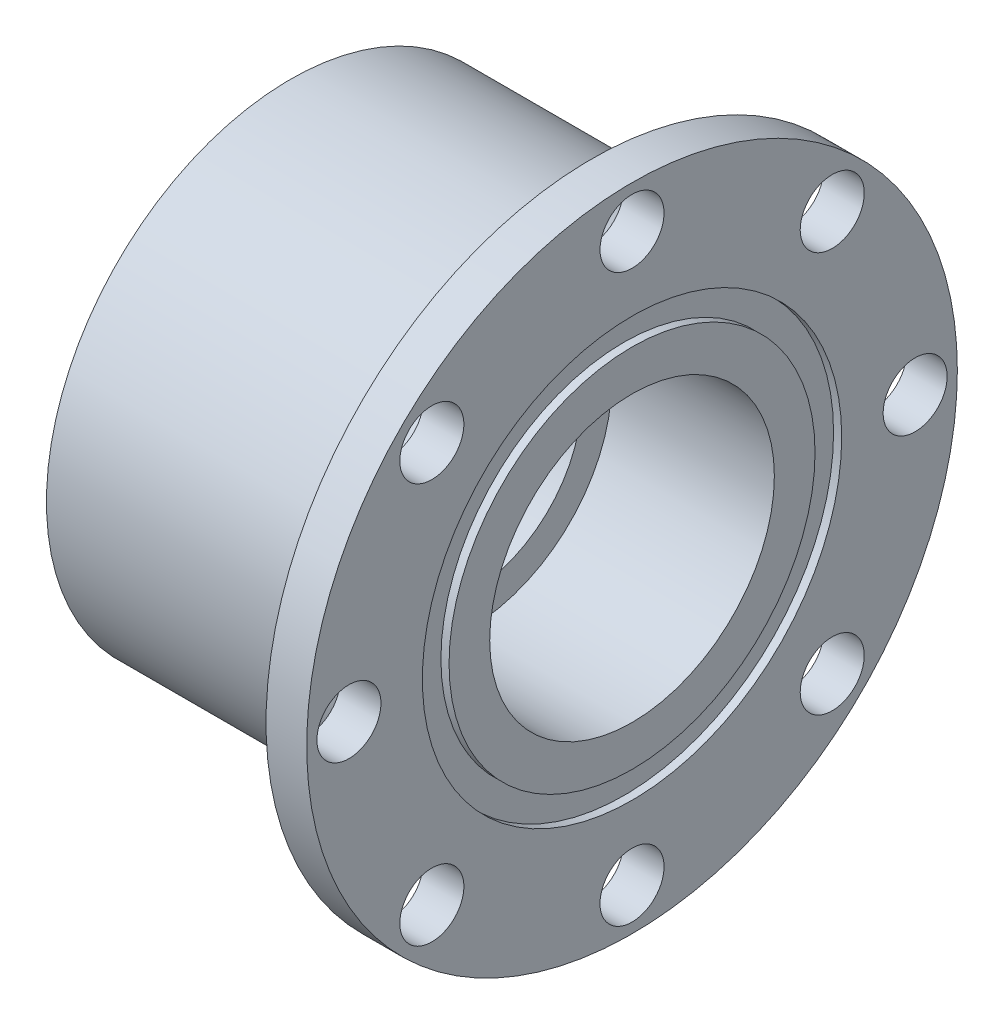
ISO-10303-21;
HEADER;
FILE_DESCRIPTION(('STEP AP214'),'2;1');
FILE_NAME('part.step','',(''),(''),'','','');
FILE_SCHEMA(('AUTOMOTIVE_DESIGN { 1 0 10303 214 1 1 1 1 }'));
ENDSEC;
DATA;
#1=APPLICATION_CONTEXT('core data for automotive mechanical design processes');
#2=APPLICATION_PROTOCOL_DEFINITION('international standard','automotive_design',2000,#1);
#3=PRODUCT_CONTEXT('',#1,'mechanical');
#4=PRODUCT('Part','Part','',(#3));
#5=PRODUCT_RELATED_PRODUCT_CATEGORY('part','',(#4));
#6=PRODUCT_DEFINITION_FORMATION('','',#4);
#7=PRODUCT_DEFINITION_CONTEXT('part definition',#1,'design');
#8=PRODUCT_DEFINITION('design','',#6,#7);
#9=PRODUCT_DEFINITION_SHAPE('','',#8);
#10=(LENGTH_UNIT() NAMED_UNIT(*) SI_UNIT(.MILLI.,.METRE.));
#11=(NAMED_UNIT(*) PLANE_ANGLE_UNIT() SI_UNIT($,.RADIAN.));
#12=(NAMED_UNIT(*) SI_UNIT($,.STERADIAN.) SOLID_ANGLE_UNIT());
#13=UNCERTAINTY_MEASURE_WITH_UNIT(LENGTH_MEASURE(1.E-05),#10,'distance_accuracy_value','');
#14=(GEOMETRIC_REPRESENTATION_CONTEXT(3) GLOBAL_UNCERTAINTY_ASSIGNED_CONTEXT((#13)) GLOBAL_UNIT_ASSIGNED_CONTEXT((#10,
#11,#12)) REPRESENTATION_CONTEXT('',''));
#15=CARTESIAN_POINT('',(0.,0.,0.));
#16=DIRECTION('',(0.,0.,1.));
#17=DIRECTION('',(1.,0.,0.));
#18=AXIS2_PLACEMENT_3D('',#15,#16,#17);
#19=CARTESIAN_POINT('',(53.34,0.,0.));
#20=DIRECTION('',(1.,0.,0.));
#21=DIRECTION('',(0.,0.,-1.));
#22=AXIS2_PLACEMENT_3D('',#19,#20,#21);
#23=PLANE('',#22);
#24=CARTESIAN_POINT('',(53.34,0.,0.));
#25=DIRECTION('',(1.,0.,0.));
#26=DIRECTION('',(0.,0.,-1.));
#27=AXIS2_PLACEMENT_3D('',#24,#25,#26);
#28=CIRCLE('',#27,22.225);
#29=CARTESIAN_POINT('',(53.34,0.,-22.225));
#30=VERTEX_POINT('',#29);
#31=EDGE_CURVE('E61',#30,#30,#28,.T.);
#32=ORIENTED_EDGE('',*,*,#31,.F.);
#33=EDGE_LOOP('',(#32));
#34=FACE_BOUND('',#33,.T.);
#35=CARTESIAN_POINT('',(53.34,0.,0.));
#36=DIRECTION('',(1.,0.,0.));
#37=DIRECTION('',(0.,0.,-1.));
#38=AXIS2_PLACEMENT_3D('',#35,#36,#37);
#39=CIRCLE('',#38,28.575);
#40=CARTESIAN_POINT('',(53.34,0.,-28.575));
#41=VERTEX_POINT('',#40);
#42=EDGE_CURVE('E243',#41,#41,#39,.T.);
#43=ORIENTED_EDGE('',*,*,#42,.T.);
#44=EDGE_LOOP('',(#43));
#45=FACE_BOUND('',#44,.T.);
#46=ADVANCED_FACE('F43',(#34,#45),#23,.T.);
#47=CARTESIAN_POINT('',(46.99,0.,0.));
#48=DIRECTION('',(1.,0.,0.));
#49=DIRECTION('',(0.,0.,-1.));
#50=AXIS2_PLACEMENT_3D('',#47,#48,#49);
#51=PLANE('',#50);
#52=CARTESIAN_POINT('',(46.99,0.,-44.2066880427784));
#53=DIRECTION('',(-1.,0.,0.));
#54=DIRECTION('',(0.,0.,1.));
#55=AXIS2_PLACEMENT_3D('',#52,#53,#54);
#56=CIRCLE('',#55,5.);
#57=CARTESIAN_POINT('',(46.99,0.,-39.2066880427784));
#58=VERTEX_POINT('',#57);
#59=EDGE_CURVE('E250',#58,#58,#56,.T.);
#60=ORIENTED_EDGE('',*,*,#59,.F.);
#61=EDGE_LOOP('',(#60));
#62=FACE_BOUND('',#61,.T.);
#63=CARTESIAN_POINT('',(46.99,31.2588488888469,-31.2588488888468));
#64=DIRECTION('',(-1.,0.,0.));
#65=DIRECTION('',(0.,0.,1.));
#66=AXIS2_PLACEMENT_3D('',#63,#64,#65);
#67=CIRCLE('',#66,5.);
#68=CARTESIAN_POINT('',(46.99,31.2588488888469,-26.2588488888468));
#69=VERTEX_POINT('',#68);
#70=EDGE_CURVE('E255',#69,#69,#67,.T.);
#71=ORIENTED_EDGE('',*,*,#70,.F.);
#72=EDGE_LOOP('',(#71));
#73=FACE_BOUND('',#72,.T.);
#74=CARTESIAN_POINT('',(46.99,44.2066880427784,1.54346826353421E-13));
#75=DIRECTION('',(-1.,0.,0.));
#76=DIRECTION('',(0.,0.,1.));
#77=AXIS2_PLACEMENT_3D('',#74,#75,#76);
#78=CIRCLE('',#77,5.);
#79=CARTESIAN_POINT('',(46.99,44.2066880427784,5.00000000000015));
#80=VERTEX_POINT('',#79);
#81=EDGE_CURVE('E259',#80,#80,#78,.T.);
#82=ORIENTED_EDGE('',*,*,#81,.F.);
#83=EDGE_LOOP('',(#82));
#84=FACE_BOUND('',#83,.T.);
#85=CARTESIAN_POINT('',(46.99,-3.08693652706841E-13,44.2066880427784));
#86=DIRECTION('',(-1.,0.,0.));
#87=DIRECTION('',(0.,0.,1.));
#88=AXIS2_PLACEMENT_3D('',#85,#86,#87);
#89=CIRCLE('',#88,5.);
#90=CARTESIAN_POINT('',(46.99,-3.08693652706841E-13,49.2066880427784));
#91=VERTEX_POINT('',#90);
#92=EDGE_CURVE('E267',#91,#91,#89,.T.);
#93=ORIENTED_EDGE('',*,*,#92,.F.);
#94=EDGE_LOOP('',(#93));
#95=FACE_BOUND('',#94,.T.);
#96=CARTESIAN_POINT('',(46.99,-31.2588488888471,31.2588488888466));
#97=DIRECTION('',(-1.,0.,0.));
#98=DIRECTION('',(0.,0.,1.));
#99=AXIS2_PLACEMENT_3D('',#96,#97,#98);
#100=CIRCLE('',#99,5.);
#101=CARTESIAN_POINT('',(46.99,-31.2588488888471,36.2588488888466));
#102=VERTEX_POINT('',#101);
#103=EDGE_CURVE('E271',#102,#102,#100,.T.);
#104=ORIENTED_EDGE('',*,*,#103,.F.);
#105=EDGE_LOOP('',(#104));
#106=FACE_BOUND('',#105,.T.);
#107=CARTESIAN_POINT('',(46.99,-44.2066880427784,-4.63040479060262E-13));
#108=DIRECTION('',(-1.,0.,0.));
#109=DIRECTION('',(0.,0.,1.));
#110=AXIS2_PLACEMENT_3D('',#107,#108,#109);
#111=CIRCLE('',#110,5.);
#112=CARTESIAN_POINT('',(46.99,-44.2066880427784,4.99999999999953));
#113=VERTEX_POINT('',#112);
#114=EDGE_CURVE('E164',#113,#113,#111,.T.);
#115=ORIENTED_EDGE('',*,*,#114,.F.);
#116=EDGE_LOOP('',(#115));
#117=FACE_BOUND('',#116,.T.);
#118=CARTESIAN_POINT('',(46.99,0.,0.));
#119=DIRECTION('',(1.,0.,0.));
#120=DIRECTION('',(0.,0.,-1.));
#121=AXIS2_PLACEMENT_3D('',#118,#119,#120);
#122=CIRCLE('',#121,50.8);
#123=CARTESIAN_POINT('',(46.99,0.,-50.8));
#124=VERTEX_POINT('',#123);
#125=EDGE_CURVE('E68',#124,#124,#122,.T.);
#126=ORIENTED_EDGE('',*,*,#125,.F.);
#127=EDGE_LOOP('',(#126));
#128=FACE_BOUND('',#127,.T.);
#129=CARTESIAN_POINT('',(46.99,0.,0.));
#130=DIRECTION('',(1.,0.,0.));
#131=DIRECTION('',(0.,0.,-1.));
#132=AXIS2_PLACEMENT_3D('',#129,#130,#131);
#133=CIRCLE('',#132,38.1);
#134=CARTESIAN_POINT('',(46.99,0.,-38.1));
#135=VERTEX_POINT('',#134);
#136=EDGE_CURVE('E10',#135,#135,#133,.T.);
#137=ORIENTED_EDGE('',*,*,#136,.T.);
#138=EDGE_LOOP('',(#137));
#139=FACE_BOUND('',#138,.T.);
#140=CARTESIAN_POINT('',(46.99,-31.2588488888465,-31.2588488888472));
#141=DIRECTION('',(-1.,0.,0.));
#142=DIRECTION('',(0.,0.,1.));
#143=AXIS2_PLACEMENT_3D('',#140,#141,#142);
#144=CIRCLE('',#143,5.);
#145=CARTESIAN_POINT('',(46.99,-31.2588488888465,-26.2588488888472));
#146=VERTEX_POINT('',#145);
#147=EDGE_CURVE('E163',#146,#146,#144,.T.);
#148=ORIENTED_EDGE('',*,*,#147,.F.);
#149=EDGE_LOOP('',(#148));
#150=FACE_BOUND('',#149,.T.);
#151=CARTESIAN_POINT('',(46.99,31.2588488888467,31.258848888847));
#152=DIRECTION('',(-1.,0.,0.));
#153=DIRECTION('',(0.,0.,1.));
#154=AXIS2_PLACEMENT_3D('',#151,#152,#153);
#155=CIRCLE('',#154,5.);
#156=CARTESIAN_POINT('',(46.99,31.2588488888467,36.258848888847));
#157=VERTEX_POINT('',#156);
#158=EDGE_CURVE('E263',#157,#157,#155,.T.);
#159=ORIENTED_EDGE('',*,*,#158,.F.);
#160=EDGE_LOOP('',(#159));
#161=FACE_BOUND('',#160,.T.);
#162=ADVANCED_FACE('F104',(#62,#73,#84,#95,#106,#117,#128,#139,#150,#161),#51,.F.);
#163=CARTESIAN_POINT('',(53.34,0.,0.));
#164=DIRECTION('',(1.,0.,0.));
#165=DIRECTION('',(0.,0.,-1.));
#166=AXIS2_PLACEMENT_3D('',#163,#164,#165);
#167=CIRCLE('',#166,32.7406);
#168=CARTESIAN_POINT('',(53.34,0.,-32.7406));
#169=VERTEX_POINT('',#168);
#170=EDGE_CURVE('E127',#169,#169,#167,.T.);
#171=ORIENTED_EDGE('',*,*,#170,.F.);
#172=EDGE_LOOP('',(#171));
#173=FACE_BOUND('',#172,.T.);
#174=CARTESIAN_POINT('',(53.34,0.,-44.2066880427784));
#175=DIRECTION('',(-1.,0.,0.));
#176=DIRECTION('',(0.,0.,1.));
#177=AXIS2_PLACEMENT_3D('',#174,#175,#176);
#178=CIRCLE('',#177,5.);
#179=CARTESIAN_POINT('',(53.34,0.,-39.2066880427784));
#180=VERTEX_POINT('',#179);
#181=EDGE_CURVE('E131',#180,#180,#178,.T.);
#182=ORIENTED_EDGE('',*,*,#181,.T.);
#183=EDGE_LOOP('',(#182));
#184=FACE_BOUND('',#183,.T.);
#185=CARTESIAN_POINT('',(53.34,31.2588488888469,-31.2588488888468));
#186=DIRECTION('',(-1.,0.,0.));
#187=DIRECTION('',(0.,0.,1.));
#188=AXIS2_PLACEMENT_3D('',#185,#186,#187);
#189=CIRCLE('',#188,5.);
#190=CARTESIAN_POINT('',(53.34,31.2588488888469,-26.2588488888468));
#191=VERTEX_POINT('',#190);
#192=EDGE_CURVE('E135',#191,#191,#189,.T.);
#193=ORIENTED_EDGE('',*,*,#192,.T.);
#194=EDGE_LOOP('',(#193));
#195=FACE_BOUND('',#194,.T.);
#196=CARTESIAN_POINT('',(53.34,44.2066880427784,1.54346826353421E-13));
#197=DIRECTION('',(-1.,0.,0.));
#198=DIRECTION('',(0.,0.,1.));
#199=AXIS2_PLACEMENT_3D('',#196,#197,#198);
#200=CIRCLE('',#199,5.);
#201=CARTESIAN_POINT('',(53.34,44.2066880427784,5.00000000000015));
#202=VERTEX_POINT('',#201);
#203=EDGE_CURVE('E139',#202,#202,#200,.T.);
#204=ORIENTED_EDGE('',*,*,#203,.T.);
#205=EDGE_LOOP('',(#204));
#206=FACE_BOUND('',#205,.T.);
#207=CARTESIAN_POINT('',(53.34,31.2588488888467,31.258848888847));
#208=DIRECTION('',(-1.,0.,0.));
#209=DIRECTION('',(0.,0.,1.));
#210=AXIS2_PLACEMENT_3D('',#207,#208,#209);
#211=CIRCLE('',#210,5.);
#212=CARTESIAN_POINT('',(53.34,31.2588488888467,36.258848888847));
#213=VERTEX_POINT('',#212);
#214=EDGE_CURVE('E143',#213,#213,#211,.T.);
#215=ORIENTED_EDGE('',*,*,#214,.T.);
#216=EDGE_LOOP('',(#215));
#217=FACE_BOUND('',#216,.T.);
#218=CARTESIAN_POINT('',(53.34,-3.08693652706841E-13,44.2066880427784));
#219=DIRECTION('',(-1.,0.,0.));
#220=DIRECTION('',(0.,0.,1.));
#221=AXIS2_PLACEMENT_3D('',#218,#219,#220);
#222=CIRCLE('',#221,5.);
#223=CARTESIAN_POINT('',(53.34,-3.08693652706841E-13,49.2066880427784));
#224=VERTEX_POINT('',#223);
#225=EDGE_CURVE('E147',#224,#224,#222,.T.);
#226=ORIENTED_EDGE('',*,*,#225,.T.);
#227=EDGE_LOOP('',(#226));
#228=FACE_BOUND('',#227,.T.);
#229=CARTESIAN_POINT('',(53.34,-31.2588488888471,31.2588488888466));
#230=DIRECTION('',(-1.,0.,0.));
#231=DIRECTION('',(0.,0.,1.));
#232=AXIS2_PLACEMENT_3D('',#229,#230,#231);
#233=CIRCLE('',#232,5.);
#234=CARTESIAN_POINT('',(53.34,-31.2588488888471,36.2588488888466));
#235=VERTEX_POINT('',#234);
#236=EDGE_CURVE('E151',#235,#235,#233,.T.);
#237=ORIENTED_EDGE('',*,*,#236,.T.);
#238=EDGE_LOOP('',(#237));
#239=FACE_BOUND('',#238,.T.);
#240=CARTESIAN_POINT('',(53.34,0.,0.));
#241=DIRECTION('',(1.,0.,0.));
#242=DIRECTION('',(0.,0.,-1.));
#243=AXIS2_PLACEMENT_3D('',#240,#241,#242);
#244=CIRCLE('',#243,50.8);
#245=CARTESIAN_POINT('',(53.34,0.,-50.8));
#246=VERTEX_POINT('',#245);
#247=EDGE_CURVE('E59',#246,#246,#244,.T.);
#248=ORIENTED_EDGE('',*,*,#247,.T.);
#249=EDGE_LOOP('',(#248));
#250=FACE_BOUND('',#249,.T.);
#251=CARTESIAN_POINT('',(53.34,-31.2588488888465,-31.2588488888472));
#252=DIRECTION('',(-1.,0.,0.));
#253=DIRECTION('',(0.,0.,1.));
#254=AXIS2_PLACEMENT_3D('',#251,#252,#253);
#255=CIRCLE('',#254,5.);
#256=CARTESIAN_POINT('',(53.34,-31.2588488888465,-26.2588488888472));
#257=VERTEX_POINT('',#256);
#258=EDGE_CURVE('E158',#257,#257,#255,.T.);
#259=ORIENTED_EDGE('',*,*,#258,.T.);
#260=EDGE_LOOP('',(#259));
#261=FACE_BOUND('',#260,.T.);
#262=CARTESIAN_POINT('',(53.34,-44.2066880427784,-4.63040479060262E-13));
#263=DIRECTION('',(-1.,0.,0.));
#264=DIRECTION('',(0.,0.,1.));
#265=AXIS2_PLACEMENT_3D('',#262,#263,#264);
#266=CIRCLE('',#265,5.);
#267=CARTESIAN_POINT('',(53.34,-44.2066880427784,4.99999999999953));
#268=VERTEX_POINT('',#267);
#269=EDGE_CURVE('E161',#268,#268,#266,.T.);
#270=ORIENTED_EDGE('',*,*,#269,.T.);
#271=EDGE_LOOP('',(#270));
#272=FACE_BOUND('',#271,.T.);
#273=ADVANCED_FACE('F106',(#173,#184,#195,#206,#217,#228,#239,#250,#261,#272),#23,.T.);
#274=CARTESIAN_POINT('',(17.69,0.,0.));
#275=DIRECTION('',(1.,0.,0.));
#276=DIRECTION('',(0.,0.,-1.));
#277=AXIS2_PLACEMENT_3D('',#274,#275,#276);
#278=CYLINDRICAL_SURFACE('',#277,9.);
#279=CARTESIAN_POINT('',(17.69,0.,0.));
#280=DIRECTION('',(1.,0.,0.));
#281=DIRECTION('',(0.,0.,-1.));
#282=AXIS2_PLACEMENT_3D('',#279,#280,#281);
#283=CIRCLE('',#282,9.);
#284=CARTESIAN_POINT('',(17.69,0.,-9.));
#285=VERTEX_POINT('',#284);
#286=EDGE_CURVE('E64',#285,#285,#283,.T.);
#287=ORIENTED_EDGE('',*,*,#286,.T.);
#288=EDGE_LOOP('',(#287));
#289=FACE_BOUND('',#288,.T.);
#290=CARTESIAN_POINT('',(13.,0.,0.));
#291=DIRECTION('',(-1.,0.,0.));
#292=DIRECTION('',(0.,0.,1.));
#293=AXIS2_PLACEMENT_3D('',#290,#291,#292);
#294=CIRCLE('',#293,9.);
#295=CARTESIAN_POINT('',(13.,0.,9.));
#296=VERTEX_POINT('',#295);
#297=EDGE_CURVE('E47',#296,#296,#294,.F.);
#298=ORIENTED_EDGE('',*,*,#297,.F.);
#299=EDGE_LOOP('',(#298));
#300=FACE_BOUND('',#299,.T.);
#301=ADVANCED_FACE('F117',(#289,#300),#278,.F.);
#302=CARTESIAN_POINT('',(27.94,0.,0.));
#303=DIRECTION('',(-1.,0.,0.));
#304=DIRECTION('',(0.,0.,1.));
#305=AXIS2_PLACEMENT_3D('',#302,#303,#304);
#306=CYLINDRICAL_SURFACE('',#305,38.1);
#307=CARTESIAN_POINT('',(0.,0.,0.));
#308=DIRECTION('',(1.,0.,0.));
#309=DIRECTION('',(0.,0.,-1.));
#310=AXIS2_PLACEMENT_3D('',#307,#308,#309);
#311=CIRCLE('',#310,38.1);
#312=CARTESIAN_POINT('',(0.,0.,-38.1));
#313=VERTEX_POINT('',#312);
#314=EDGE_CURVE('E51',#313,#313,#311,.T.);
#315=ORIENTED_EDGE('',*,*,#314,.T.);
#316=EDGE_LOOP('',(#315));
#317=FACE_BOUND('',#316,.T.);
#318=ORIENTED_EDGE('',*,*,#136,.F.);
#319=EDGE_LOOP('',(#318));
#320=FACE_BOUND('',#319,.T.);
#321=ADVANCED_FACE('F45',(#317,#320),#306,.T.);
#322=CARTESIAN_POINT('',(27.94,0.,0.));
#323=DIRECTION('',(1.,0.,0.));
#324=DIRECTION('',(0.,0.,-1.));
#325=AXIS2_PLACEMENT_3D('',#322,#323,#324);
#326=PLANE('',#325);
#327=CARTESIAN_POINT('',(27.94,0.,0.));
#328=DIRECTION('',(1.,0.,0.));
#329=DIRECTION('',(0.,0.,-1.));
#330=AXIS2_PLACEMENT_3D('',#327,#328,#329);
#331=CIRCLE('',#330,17.5);
#332=CARTESIAN_POINT('',(27.94,0.,-17.5));
#333=VERTEX_POINT('',#332);
#334=EDGE_CURVE('E71',#333,#333,#331,.T.);
#335=ORIENTED_EDGE('',*,*,#334,.F.);
#336=EDGE_LOOP('',(#335));
#337=FACE_BOUND('',#336,.T.);
#338=CARTESIAN_POINT('',(27.94,0.,0.));
#339=DIRECTION('',(1.,0.,0.));
#340=DIRECTION('',(0.,0.,-1.));
#341=AXIS2_PLACEMENT_3D('',#338,#339,#340);
#342=CIRCLE('',#341,22.225);
#343=CARTESIAN_POINT('',(27.94,0.,-22.225));
#344=VERTEX_POINT('',#343);
#345=EDGE_CURVE('E65',#344,#344,#342,.T.);
#346=ORIENTED_EDGE('',*,*,#345,.T.);
#347=EDGE_LOOP('',(#346));
#348=FACE_BOUND('',#347,.T.);
#349=ADVANCED_FACE('F79',(#337,#348),#326,.T.);
#350=CARTESIAN_POINT('',(0.,0.,0.));
#351=DIRECTION('',(1.,0.,0.));
#352=DIRECTION('',(0.,0.,-1.));
#353=AXIS2_PLACEMENT_3D('',#350,#351,#352);
#354=PLANE('',#353);
#355=CARTESIAN_POINT('',(0.,0.,0.));
#356=DIRECTION('',(-1.,0.,0.));
#357=DIRECTION('',(0.,0.,1.));
#358=AXIS2_PLACEMENT_3D('',#355,#356,#357);
#359=CIRCLE('',#358,20.);
#360=CARTESIAN_POINT('',(0.,0.,20.));
#361=VERTEX_POINT('',#360);
#362=EDGE_CURVE('E173',#361,#361,#359,.T.);
#363=ORIENTED_EDGE('',*,*,#362,.F.);
#364=EDGE_LOOP('',(#363));
#365=FACE_BOUND('',#364,.T.);
#366=ORIENTED_EDGE('',*,*,#314,.F.);
#367=EDGE_LOOP('',(#366));
#368=FACE_BOUND('',#367,.T.);
#369=ADVANCED_FACE('F82',(#365,#368),#354,.F.);
#370=CARTESIAN_POINT('',(17.69,0.,0.));
#371=DIRECTION('',(1.,0.,0.));
#372=DIRECTION('',(0.,0.,-1.));
#373=AXIS2_PLACEMENT_3D('',#370,#371,#372);
#374=CYLINDRICAL_SURFACE('',#373,17.5);
#375=CARTESIAN_POINT('',(17.69,0.,0.));
#376=DIRECTION('',(1.,0.,0.));
#377=DIRECTION('',(0.,0.,-1.));
#378=AXIS2_PLACEMENT_3D('',#375,#376,#377);
#379=CIRCLE('',#378,17.5);
#380=CARTESIAN_POINT('',(17.69,0.,-17.5));
#381=VERTEX_POINT('',#380);
#382=EDGE_CURVE('E56',#381,#381,#379,.T.);
#383=ORIENTED_EDGE('',*,*,#382,.F.);
#384=EDGE_LOOP('',(#383));
#385=FACE_BOUND('',#384,.T.);
#386=ORIENTED_EDGE('',*,*,#334,.T.);
#387=EDGE_LOOP('',(#386));
#388=FACE_BOUND('',#387,.T.);
#389=ADVANCED_FACE('F77',(#385,#388),#374,.F.);
#390=CARTESIAN_POINT('',(17.69,0.,0.));
#391=DIRECTION('',(1.,0.,0.));
#392=DIRECTION('',(0.,0.,-1.));
#393=AXIS2_PLACEMENT_3D('',#390,#391,#392);
#394=PLANE('',#393);
#395=ORIENTED_EDGE('',*,*,#286,.F.);
#396=EDGE_LOOP('',(#395));
#397=FACE_BOUND('',#396,.T.);
#398=ORIENTED_EDGE('',*,*,#382,.T.);
#399=EDGE_LOOP('',(#398));
#400=FACE_BOUND('',#399,.T.);
#401=ADVANCED_FACE('F89',(#397,#400),#394,.T.);
#402=CARTESIAN_POINT('',(53.34,0.,0.));
#403=DIRECTION('',(-1.,0.,0.));
#404=DIRECTION('',(0.,0.,1.));
#405=AXIS2_PLACEMENT_3D('',#402,#403,#404);
#406=CYLINDRICAL_SURFACE('',#405,22.225);
#407=ORIENTED_EDGE('',*,*,#31,.T.);
#408=EDGE_LOOP('',(#407));
#409=FACE_BOUND('',#408,.T.);
#410=ORIENTED_EDGE('',*,*,#345,.F.);
#411=EDGE_LOOP('',(#410));
#412=FACE_BOUND('',#411,.T.);
#413=ADVANCED_FACE('F86',(#409,#412),#406,.F.);
#414=CARTESIAN_POINT('',(46.99,0.,0.));
#415=DIRECTION('',(1.,0.,0.));
#416=DIRECTION('',(0.,0.,-1.));
#417=AXIS2_PLACEMENT_3D('',#414,#415,#416);
#418=CYLINDRICAL_SURFACE('',#417,50.8);
#419=ORIENTED_EDGE('',*,*,#125,.T.);
#420=EDGE_LOOP('',(#419));
#421=FACE_BOUND('',#420,.T.);
#422=ORIENTED_EDGE('',*,*,#247,.F.);
#423=EDGE_LOOP('',(#422));
#424=FACE_BOUND('',#423,.T.);
#425=ADVANCED_FACE('F88',(#421,#424),#418,.T.);
#426=CARTESIAN_POINT('',(13.,0.,0.));
#427=DIRECTION('',(-1.,0.,0.));
#428=DIRECTION('',(0.,0.,1.));
#429=AXIS2_PLACEMENT_3D('',#426,#427,#428);
#430=PLANE('',#429);
#431=CARTESIAN_POINT('',(13.,0.,0.));
#432=DIRECTION('',(-1.,0.,0.));
#433=DIRECTION('',(0.,0.,1.));
#434=AXIS2_PLACEMENT_3D('',#431,#432,#433);
#435=CIRCLE('',#434,20.);
#436=CARTESIAN_POINT('',(13.,0.,20.));
#437=VERTEX_POINT('',#436);
#438=EDGE_CURVE('E174',#437,#437,#435,.T.);
#439=ORIENTED_EDGE('',*,*,#438,.T.);
#440=EDGE_LOOP('',(#439));
#441=FACE_BOUND('',#440,.T.);
#442=ORIENTED_EDGE('',*,*,#297,.T.);
#443=EDGE_LOOP('',(#442));
#444=FACE_BOUND('',#443,.T.);
#445=ADVANCED_FACE('F96',(#441,#444),#430,.T.);
#446=CARTESIAN_POINT('',(13.,0.,0.));
#447=DIRECTION('',(-1.,0.,0.));
#448=DIRECTION('',(0.,0.,1.));
#449=AXIS2_PLACEMENT_3D('',#446,#447,#448);
#450=CYLINDRICAL_SURFACE('',#449,20.);
#451=CARTESIAN_POINT('',(13.,0.,20.));
#452=CARTESIAN_POINT('',(12.8645833333333,0.,20.));
#453=CARTESIAN_POINT('',(12.7291666666667,0.,20.));
#454=CARTESIAN_POINT('',(12.4583333333333,0.,20.));
#455=CARTESIAN_POINT('',(12.3229166666667,0.,20.));
#456=CARTESIAN_POINT('',(12.0520833333333,0.,20.));
#457=CARTESIAN_POINT('',(11.9166666666667,0.,20.));
#458=CARTESIAN_POINT('',(11.6458333333333,0.,20.));
#459=CARTESIAN_POINT('',(11.5104166666667,0.,20.));
#460=CARTESIAN_POINT('',(11.2395833333333,0.,20.));
#461=CARTESIAN_POINT('',(11.1041666666667,0.,20.));
#462=CARTESIAN_POINT('',(10.8333333333333,0.,20.));
#463=CARTESIAN_POINT('',(10.6979166666667,0.,20.));
#464=CARTESIAN_POINT('',(10.4270833333333,0.,20.));
#465=CARTESIAN_POINT('',(10.2916666666667,0.,20.));
#466=CARTESIAN_POINT('',(10.0208333333333,0.,20.));
#467=CARTESIAN_POINT('',(9.88541666666667,0.,20.));
#468=CARTESIAN_POINT('',(9.61458333333333,0.,20.));
#469=CARTESIAN_POINT('',(9.47916666666667,0.,20.));
#470=CARTESIAN_POINT('',(9.20833333333333,0.,20.));
#471=CARTESIAN_POINT('',(9.07291666666667,0.,20.));
#472=CARTESIAN_POINT('',(8.80208333333333,0.,20.));
#473=CARTESIAN_POINT('',(8.66666666666667,0.,20.));
#474=CARTESIAN_POINT('',(8.39583333333333,0.,20.));
#475=CARTESIAN_POINT('',(8.26041666666667,0.,20.));
#476=CARTESIAN_POINT('',(7.98958333333333,0.,20.));
#477=CARTESIAN_POINT('',(7.85416666666667,0.,20.));
#478=CARTESIAN_POINT('',(7.58333333333333,0.,20.));
#479=CARTESIAN_POINT('',(7.44791666666667,0.,20.));
#480=CARTESIAN_POINT('',(7.17708333333333,0.,20.));
#481=CARTESIAN_POINT('',(7.04166666666667,0.,20.));
#482=CARTESIAN_POINT('',(6.77083333333333,0.,20.));
#483=CARTESIAN_POINT('',(6.63541666666667,0.,20.));
#484=CARTESIAN_POINT('',(6.36458333333333,0.,20.));
#485=CARTESIAN_POINT('',(6.22916666666667,0.,20.));
#486=CARTESIAN_POINT('',(5.95833333333333,0.,20.));
#487=CARTESIAN_POINT('',(5.82291666666667,0.,20.));
#488=CARTESIAN_POINT('',(5.55208333333333,0.,20.));
#489=CARTESIAN_POINT('',(5.41666666666667,0.,20.));
#490=CARTESIAN_POINT('',(5.14583333333333,0.,20.));
#491=CARTESIAN_POINT('',(5.01041666666667,0.,20.));
#492=CARTESIAN_POINT('',(4.73958333333333,0.,20.));
#493=CARTESIAN_POINT('',(4.60416666666667,0.,20.));
#494=CARTESIAN_POINT('',(4.33333333333333,0.,20.));
#495=CARTESIAN_POINT('',(4.19791666666667,0.,20.));
#496=CARTESIAN_POINT('',(3.92708333333333,0.,20.));
#497=CARTESIAN_POINT('',(3.79166666666667,0.,20.));
#498=CARTESIAN_POINT('',(3.52083333333333,0.,20.));
#499=CARTESIAN_POINT('',(3.38541666666667,0.,20.));
#500=CARTESIAN_POINT('',(3.11458333333333,0.,20.));
#501=CARTESIAN_POINT('',(2.97916666666667,0.,20.));
#502=CARTESIAN_POINT('',(2.70833333333333,0.,20.));
#503=CARTESIAN_POINT('',(2.57291666666667,0.,20.));
#504=CARTESIAN_POINT('',(2.30208333333333,0.,20.));
#505=CARTESIAN_POINT('',(2.16666666666667,0.,20.));
#506=CARTESIAN_POINT('',(1.89583333333333,0.,20.));
#507=CARTESIAN_POINT('',(1.76041666666667,0.,20.));
#508=CARTESIAN_POINT('',(1.48958333333333,0.,20.));
#509=CARTESIAN_POINT('',(1.35416666666667,0.,20.));
#510=CARTESIAN_POINT('',(1.08333333333333,0.,20.));
#511=CARTESIAN_POINT('',(0.947916666666667,0.,20.));
#512=CARTESIAN_POINT('',(0.677083333333334,0.,20.));
#513=CARTESIAN_POINT('',(0.541666666666667,0.,20.));
#514=CARTESIAN_POINT('',(0.270833333333334,0.,20.));
#515=CARTESIAN_POINT('',(0.135416666666667,0.,20.));
#516=CARTESIAN_POINT('',(0.,0.,20.));
#517=B_SPLINE_CURVE_WITH_KNOTS('',3,(#451,#452,#453,#454,#455,#456,#457,#458,#459,#460,#461,
#462,#463,#464,#465,#466,#467,#468,#469,#470,#471,#472,#473,#474,#475,#476,#477,#478,#479,#480,
#481,#482,#483,#484,#485,#486,#487,#488,#489,#490,#491,#492,#493,#494,#495,#496,#497,#498,#499,
#500,#501,#502,#503,#504,#505,#506,#507,#508,#509,#510,#511,#512,#513,#514,#515,#516),
.UNSPECIFIED.,.F.,.F.,(4,2,2,2,2,2,2,2,2,2,2,2,2,2,2,2,2,2,2,2,2,2,2,2,2,2,2,2,2,2,2,2,4),(0.,
0.40625,0.812500000000001,1.21875,1.625,2.03125,2.4375,2.84375,3.25,3.65625,4.0625,4.46875,
4.875,5.28125,5.6875,6.09375,6.5,6.90625,7.3125,7.71875,8.125,8.53125,8.9375,9.34375,9.75,
10.15625,10.5625,10.96875,11.375,11.78125,12.1875,12.59375,13.),.UNSPECIFIED.);
#518=EDGE_CURVE('BSEAM185',#437,#361,#517,.T.);
#519=ORIENTED_EDGE('',*,*,#438,.F.);
#520=ORIENTED_EDGE('',*,*,#362,.T.);
#521=ORIENTED_EDGE('',*,*,#518,.T.);
#522=ORIENTED_EDGE('',*,*,#518,.F.);
#523=EDGE_LOOP('',(#519,#521,#520,#522));
#524=FACE_BOUND('',#523,.T.);
#525=ADVANCED_FACE('F185',(#524),#450,.F.);
#526=CARTESIAN_POINT('',(46.99,-31.2588488888465,-31.2588488888472));
#527=DIRECTION('',(-1.,0.,0.));
#528=DIRECTION('',(0.,0.,1.));
#529=AXIS2_PLACEMENT_3D('',#526,#527,#528);
#530=CYLINDRICAL_SURFACE('',#529,5.);
#531=ORIENTED_EDGE('',*,*,#258,.F.);
#532=EDGE_LOOP('',(#531));
#533=FACE_BOUND('',#532,.T.);
#534=ORIENTED_EDGE('',*,*,#147,.T.);
#535=EDGE_LOOP('',(#534));
#536=FACE_BOUND('',#535,.T.);
#537=ADVANCED_FACE('F192',(#533,#536),#530,.F.);
#538=CARTESIAN_POINT('',(46.99,-44.2066880427784,-4.63040479060262E-13));
#539=DIRECTION('',(-1.,0.,0.));
#540=DIRECTION('',(0.,0.,1.));
#541=AXIS2_PLACEMENT_3D('',#538,#539,#540);
#542=CYLINDRICAL_SURFACE('',#541,5.);
#543=ORIENTED_EDGE('',*,*,#269,.F.);
#544=EDGE_LOOP('',(#543));
#545=FACE_BOUND('',#544,.T.);
#546=ORIENTED_EDGE('',*,*,#114,.T.);
#547=EDGE_LOOP('',(#546));
#548=FACE_BOUND('',#547,.T.);
#549=ADVANCED_FACE('F198',(#545,#548),#542,.F.);
#550=CARTESIAN_POINT('',(46.99,-31.2588488888471,31.2588488888466));
#551=DIRECTION('',(-1.,0.,0.));
#552=DIRECTION('',(0.,0.,1.));
#553=AXIS2_PLACEMENT_3D('',#550,#551,#552);
#554=CYLINDRICAL_SURFACE('',#553,5.);
#555=ORIENTED_EDGE('',*,*,#236,.F.);
#556=EDGE_LOOP('',(#555));
#557=FACE_BOUND('',#556,.T.);
#558=ORIENTED_EDGE('',*,*,#103,.T.);
#559=EDGE_LOOP('',(#558));
#560=FACE_BOUND('',#559,.T.);
#561=ADVANCED_FACE('F202',(#557,#560),#554,.F.);
#562=CARTESIAN_POINT('',(46.99,-3.08693652706841E-13,44.2066880427784));
#563=DIRECTION('',(-1.,0.,0.));
#564=DIRECTION('',(0.,0.,1.));
#565=AXIS2_PLACEMENT_3D('',#562,#563,#564);
#566=CYLINDRICAL_SURFACE('',#565,5.);
#567=ORIENTED_EDGE('',*,*,#225,.F.);
#568=EDGE_LOOP('',(#567));
#569=FACE_BOUND('',#568,.T.);
#570=ORIENTED_EDGE('',*,*,#92,.T.);
#571=EDGE_LOOP('',(#570));
#572=FACE_BOUND('',#571,.T.);
#573=ADVANCED_FACE('F205',(#569,#572),#566,.F.);
#574=CARTESIAN_POINT('',(46.99,31.2588488888467,31.258848888847));
#575=DIRECTION('',(-1.,0.,0.));
#576=DIRECTION('',(0.,0.,1.));
#577=AXIS2_PLACEMENT_3D('',#574,#575,#576);
#578=CYLINDRICAL_SURFACE('',#577,5.);
#579=ORIENTED_EDGE('',*,*,#214,.F.);
#580=EDGE_LOOP('',(#579));
#581=FACE_BOUND('',#580,.T.);
#582=ORIENTED_EDGE('',*,*,#158,.T.);
#583=EDGE_LOOP('',(#582));
#584=FACE_BOUND('',#583,.T.);
#585=ADVANCED_FACE('F209',(#581,#584),#578,.F.);
#586=CARTESIAN_POINT('',(46.99,44.2066880427784,1.54346826353421E-13));
#587=DIRECTION('',(-1.,0.,0.));
#588=DIRECTION('',(0.,0.,1.));
#589=AXIS2_PLACEMENT_3D('',#586,#587,#588);
#590=CYLINDRICAL_SURFACE('',#589,5.);
#591=ORIENTED_EDGE('',*,*,#203,.F.);
#592=EDGE_LOOP('',(#591));
#593=FACE_BOUND('',#592,.T.);
#594=ORIENTED_EDGE('',*,*,#81,.T.);
#595=EDGE_LOOP('',(#594));
#596=FACE_BOUND('',#595,.T.);
#597=ADVANCED_FACE('F213',(#593,#596),#590,.F.);
#598=CARTESIAN_POINT('',(46.99,31.2588488888469,-31.2588488888468));
#599=DIRECTION('',(-1.,0.,0.));
#600=DIRECTION('',(0.,0.,1.));
#601=AXIS2_PLACEMENT_3D('',#598,#599,#600);
#602=CYLINDRICAL_SURFACE('',#601,5.);
#603=ORIENTED_EDGE('',*,*,#192,.F.);
#604=EDGE_LOOP('',(#603));
#605=FACE_BOUND('',#604,.T.);
#606=ORIENTED_EDGE('',*,*,#70,.T.);
#607=EDGE_LOOP('',(#606));
#608=FACE_BOUND('',#607,.T.);
#609=ADVANCED_FACE('F217',(#605,#608),#602,.F.);
#610=CARTESIAN_POINT('',(46.99,0.,-44.2066880427784));
#611=DIRECTION('',(-1.,0.,0.));
#612=DIRECTION('',(0.,0.,1.));
#613=AXIS2_PLACEMENT_3D('',#610,#611,#612);
#614=CYLINDRICAL_SURFACE('',#613,5.);
#615=ORIENTED_EDGE('',*,*,#181,.F.);
#616=EDGE_LOOP('',(#615));
#617=FACE_BOUND('',#616,.T.);
#618=ORIENTED_EDGE('',*,*,#59,.T.);
#619=EDGE_LOOP('',(#618));
#620=FACE_BOUND('',#619,.T.);
#621=ADVANCED_FACE('F221',(#617,#620),#614,.F.);
#622=CARTESIAN_POINT('',(52.07,0.,0.));
#623=DIRECTION('',(1.,0.,0.));
#624=DIRECTION('',(0.,0.,-1.));
#625=AXIS2_PLACEMENT_3D('',#622,#623,#624);
#626=CYLINDRICAL_SURFACE('',#625,32.7406);
#627=CARTESIAN_POINT('',(52.07,0.,0.));
#628=DIRECTION('',(1.,0.,0.));
#629=DIRECTION('',(0.,0.,-1.));
#630=AXIS2_PLACEMENT_3D('',#627,#628,#629);
#631=CIRCLE('',#630,32.7406);
#632=CARTESIAN_POINT('',(52.07,0.,-32.7406));
#633=VERTEX_POINT('',#632);
#634=EDGE_CURVE('E247',#633,#633,#631,.T.);
#635=ORIENTED_EDGE('',*,*,#634,.F.);
#636=EDGE_LOOP('',(#635));
#637=FACE_BOUND('',#636,.T.);
#638=ORIENTED_EDGE('',*,*,#170,.T.);
#639=EDGE_LOOP('',(#638));
#640=FACE_BOUND('',#639,.T.);
#641=ADVANCED_FACE('F224',(#637,#640),#626,.F.);
#642=CARTESIAN_POINT('',(52.07,0.,0.));
#643=DIRECTION('',(1.,0.,0.));
#644=DIRECTION('',(0.,0.,-1.));
#645=AXIS2_PLACEMENT_3D('',#642,#643,#644);
#646=PLANE('',#645);
#647=CARTESIAN_POINT('',(52.07,0.,0.));
#648=DIRECTION('',(1.,0.,0.));
#649=DIRECTION('',(0.,0.,-1.));
#650=AXIS2_PLACEMENT_3D('',#647,#648,#649);
#651=CIRCLE('',#650,28.575);
#652=CARTESIAN_POINT('',(52.07,0.,-28.575));
#653=VERTEX_POINT('',#652);
#654=EDGE_CURVE('E240',#653,#653,#651,.T.);
#655=ORIENTED_EDGE('',*,*,#654,.F.);
#656=EDGE_LOOP('',(#655));
#657=FACE_BOUND('',#656,.T.);
#658=ORIENTED_EDGE('',*,*,#634,.T.);
#659=EDGE_LOOP('',(#658));
#660=FACE_BOUND('',#659,.T.);
#661=ADVANCED_FACE('F227',(#657,#660),#646,.T.);
#662=CARTESIAN_POINT('',(52.07,0.,0.));
#663=DIRECTION('',(1.,0.,0.));
#664=DIRECTION('',(0.,0.,-1.));
#665=AXIS2_PLACEMENT_3D('',#662,#663,#664);
#666=CYLINDRICAL_SURFACE('',#665,28.575);
#667=ORIENTED_EDGE('',*,*,#654,.T.);
#668=EDGE_LOOP('',(#667));
#669=FACE_BOUND('',#668,.T.);
#670=ORIENTED_EDGE('',*,*,#42,.F.);
#671=EDGE_LOOP('',(#670));
#672=FACE_BOUND('',#671,.T.);
#673=ADVANCED_FACE('F231',(#669,#672),#666,.T.);
#674=CLOSED_SHELL('',(#46,#162,#273,#301,#321,#349,#369,#389,#401,#413,#425,#445,#525,#537,#549,
#561,#573,#585,#597,#609,#621,#641,#661,#673));
#675=MANIFOLD_SOLID_BREP('B2',#674);
#676=ADVANCED_BREP_SHAPE_REPRESENTATION('',(#18,#675),#14);
#677=SHAPE_DEFINITION_REPRESENTATION(#9,#676);
ENDSEC;
END-ISO-10303-21;
